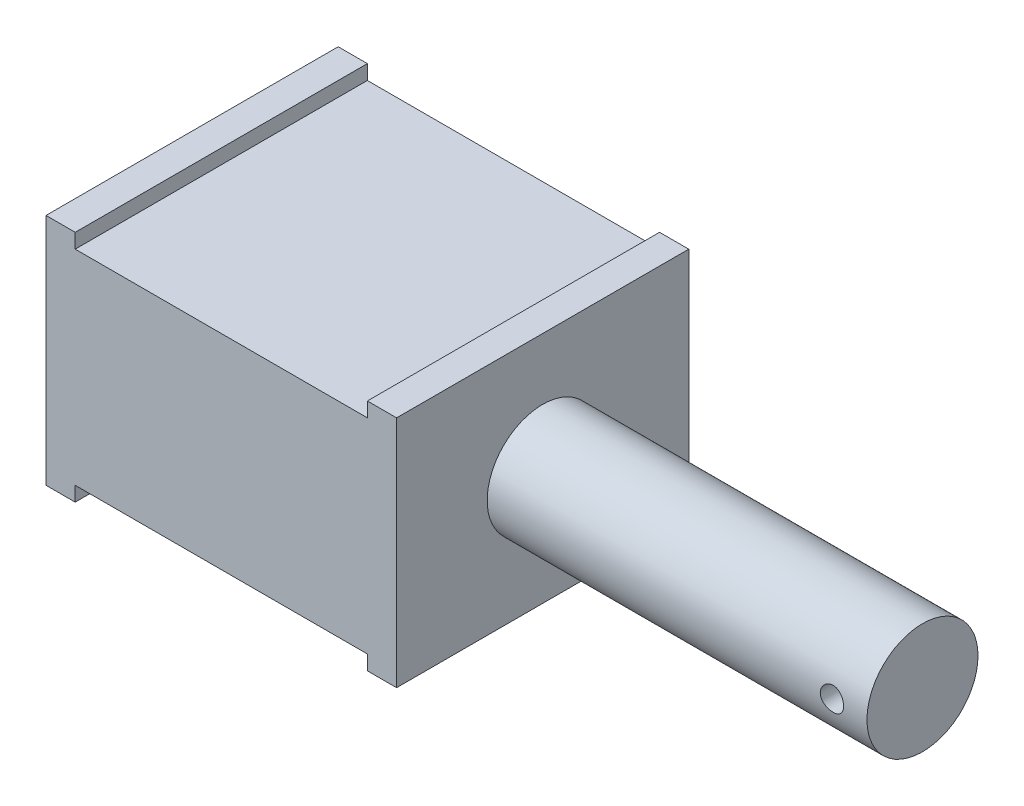
ISO-10303-21;
HEADER;
FILE_DESCRIPTION(('STEP AP214'),'2;1');
FILE_NAME('part.step','',(''),(''),'','','');
FILE_SCHEMA(('AUTOMOTIVE_DESIGN { 1 0 10303 214 1 1 1 1 }'));
ENDSEC;
DATA;
#1=APPLICATION_CONTEXT('core data for automotive mechanical design processes');
#2=APPLICATION_PROTOCOL_DEFINITION('international standard','automotive_design',2000,#1);
#3=PRODUCT_CONTEXT('',#1,'mechanical');
#4=PRODUCT('Part','Part','',(#3));
#5=PRODUCT_RELATED_PRODUCT_CATEGORY('part','',(#4));
#6=PRODUCT_DEFINITION_FORMATION('','',#4);
#7=PRODUCT_DEFINITION_CONTEXT('part definition',#1,'design');
#8=PRODUCT_DEFINITION('design','',#6,#7);
#9=PRODUCT_DEFINITION_SHAPE('','',#8);
#10=(LENGTH_UNIT() NAMED_UNIT(*) SI_UNIT(.MILLI.,.METRE.));
#11=(NAMED_UNIT(*) PLANE_ANGLE_UNIT() SI_UNIT($,.RADIAN.));
#12=(NAMED_UNIT(*) SI_UNIT($,.STERADIAN.) SOLID_ANGLE_UNIT());
#13=UNCERTAINTY_MEASURE_WITH_UNIT(LENGTH_MEASURE(1.E-05),#10,'distance_accuracy_value','');
#14=(GEOMETRIC_REPRESENTATION_CONTEXT(3) GLOBAL_UNCERTAINTY_ASSIGNED_CONTEXT((#13)) GLOBAL_UNIT_ASSIGNED_CONTEXT((#10,
#11,#12)) REPRESENTATION_CONTEXT('',''));
#15=CARTESIAN_POINT('',(0.,0.,0.));
#16=DIRECTION('',(0.,0.,1.));
#17=DIRECTION('',(1.,0.,0.));
#18=AXIS2_PLACEMENT_3D('',#15,#16,#17);
#19=CARTESIAN_POINT('',(18.,0.,0.));
#20=DIRECTION('',(0.,1.,0.));
#21=DIRECTION('',(0.,0.,1.));
#22=AXIS2_PLACEMENT_3D('',#19,#20,#21);
#23=PLANE('',#22);
#24=DIRECTION('',(-1.,0.,0.));
#25=VECTOR('',#24,1.);
#26=CARTESIAN_POINT('',(18.,0.,0.));
#27=LINE('',#26,#25);
#28=CARTESIAN_POINT('',(18.,0.,0.));
#29=VERTEX_POINT('',#28);
#30=CARTESIAN_POINT('',(16.5,0.,0.));
#31=VERTEX_POINT('',#30);
#32=EDGE_CURVE('E54',#29,#31,#27,.T.);
#33=ORIENTED_EDGE('',*,*,#32,.T.);
#34=DIRECTION('',(0.,0.,-1.));
#35=VECTOR('',#34,1.);
#36=CARTESIAN_POINT('',(16.5,0.,0.));
#37=LINE('',#36,#35);
#38=CARTESIAN_POINT('',(16.5,0.,-15.));
#39=VERTEX_POINT('',#38);
#40=EDGE_CURVE('E198',#31,#39,#37,.T.);
#41=ORIENTED_EDGE('',*,*,#40,.T.);
#42=DIRECTION('',(-1.,0.,0.));
#43=VECTOR('',#42,1.);
#44=CARTESIAN_POINT('',(18.,0.,-15.));
#45=LINE('',#44,#43);
#46=CARTESIAN_POINT('',(18.,0.,-15.));
#47=VERTEX_POINT('',#46);
#48=EDGE_CURVE('E260',#47,#39,#45,.T.);
#49=ORIENTED_EDGE('',*,*,#48,.F.);
#50=DIRECTION('',(0.,0.,-1.));
#51=VECTOR('',#50,1.);
#52=CARTESIAN_POINT('',(18.,0.,0.));
#53=LINE('',#52,#51);
#54=EDGE_CURVE('E227',#29,#47,#53,.T.);
#55=ORIENTED_EDGE('',*,*,#54,.F.);
#56=EDGE_LOOP('',(#33,#41,#49,#55));
#57=FACE_BOUND('',#56,.T.);
#58=ADVANCED_FACE('F39',(#57),#23,.F.);
#59=CARTESIAN_POINT('',(18.,12.,0.));
#60=DIRECTION('',(0.,-1.,0.));
#61=DIRECTION('',(0.,0.,-1.));
#62=AXIS2_PLACEMENT_3D('',#59,#60,#61);
#63=PLANE('',#62);
#64=DIRECTION('',(-1.,0.,0.));
#65=VECTOR('',#64,1.);
#66=CARTESIAN_POINT('',(18.,12.,-15.));
#67=LINE('',#66,#65);
#68=CARTESIAN_POINT('',(18.,12.,-15.));
#69=VERTEX_POINT('',#68);
#70=CARTESIAN_POINT('',(16.5,12.,-15.));
#71=VERTEX_POINT('',#70);
#72=EDGE_CURVE('E255',#69,#71,#67,.T.);
#73=ORIENTED_EDGE('',*,*,#72,.T.);
#74=DIRECTION('',(0.,0.,-1.));
#75=VECTOR('',#74,1.);
#76=CARTESIAN_POINT('',(16.5,12.,0.));
#77=LINE('',#76,#75);
#78=CARTESIAN_POINT('',(16.5,12.,0.));
#79=VERTEX_POINT('',#78);
#80=EDGE_CURVE('E176',#79,#71,#77,.T.);
#81=ORIENTED_EDGE('',*,*,#80,.F.);
#82=DIRECTION('',(-1.,0.,0.));
#83=VECTOR('',#82,1.);
#84=CARTESIAN_POINT('',(18.,12.,0.));
#85=LINE('',#84,#83);
#86=CARTESIAN_POINT('',(18.,12.,0.));
#87=VERTEX_POINT('',#86);
#88=EDGE_CURVE('E162',#87,#79,#85,.T.);
#89=ORIENTED_EDGE('',*,*,#88,.F.);
#90=DIRECTION('',(0.,0.,1.));
#91=VECTOR('',#90,1.);
#92=CARTESIAN_POINT('',(18.,12.,0.));
#93=LINE('',#92,#91);
#94=EDGE_CURVE('E234',#69,#87,#93,.T.);
#95=ORIENTED_EDGE('',*,*,#94,.F.);
#96=EDGE_LOOP('',(#73,#81,#89,#95));
#97=FACE_BOUND('',#96,.T.);
#98=ADVANCED_FACE('F295',(#97),#63,.F.);
#99=CARTESIAN_POINT('',(37.5,6.,-7.5));
#100=DIRECTION('',(-1.,0.,0.));
#101=DIRECTION('',(0.,0.,1.));
#102=AXIS2_PLACEMENT_3D('',#99,#100,#101);
#103=CYLINDRICAL_SURFACE('',#102,2.85);
#104=CARTESIAN_POINT('',(37.5,6.,-7.5));
#105=DIRECTION('',(1.,0.,0.));
#106=DIRECTION('',(0.,0.,-1.));
#107=AXIS2_PLACEMENT_3D('',#104,#105,#106);
#108=CIRCLE('',#107,2.85);
#109=CARTESIAN_POINT('',(37.5,6.,-10.35));
#110=VERTEX_POINT('',#109);
#111=EDGE_CURVE('E218',#110,#110,#108,.T.);
#112=ORIENTED_EDGE('',*,*,#111,.F.);
#113=EDGE_LOOP('',(#112));
#114=FACE_BOUND('',#113,.T.);
#115=CARTESIAN_POINT('',(18.,6.,-7.5));
#116=DIRECTION('',(1.,0.,0.));
#117=DIRECTION('',(0.,0.,-1.));
#118=AXIS2_PLACEMENT_3D('',#115,#116,#117);
#119=CIRCLE('',#118,2.85);
#120=CARTESIAN_POINT('',(18.,6.,-10.35));
#121=VERTEX_POINT('',#120);
#122=EDGE_CURVE('E11',#121,#121,#119,.T.);
#123=ORIENTED_EDGE('',*,*,#122,.T.);
#124=EDGE_LOOP('',(#123));
#125=FACE_BOUND('',#124,.T.);
#126=CARTESIAN_POINT('',(36.3,6.,-10.35));
#127=CARTESIAN_POINT('',(36.2999988213726,5.96669169257793,-10.3499993833989));
#128=CARTESIAN_POINT('',(36.2972170237755,5.93336885409063,-10.3494101220335));
#129=CARTESIAN_POINT('',(36.2861736647326,5.86766763069668,-10.3471163216296));
#130=CARTESIAN_POINT('',(36.2779079913875,5.83528997353559,-10.3454109457234));
#131=CARTESIAN_POINT('',(36.2561655974072,5.77243831369301,-10.3410750433109));
#132=CARTESIAN_POINT('',(36.2426941185744,5.74196243182425,-10.3384454476554));
#133=CARTESIAN_POINT('',(36.2109386880287,5.68370499133095,-10.332545831752));
#134=CARTESIAN_POINT('',(36.1926549329214,5.65592332269772,-10.329275837669));
#135=CARTESIAN_POINT('',(36.1515048949265,5.60342668300566,-10.3223998197008));
#136=CARTESIAN_POINT('',(36.1285805854412,5.57875770456691,-10.3187898860191));
#137=CARTESIAN_POINT('',(36.078924824435,5.53358525972532,-10.3116687975785));
#138=CARTESIAN_POINT('',(36.0521930532207,5.51308214346004,-10.3081576511441));
#139=CARTESIAN_POINT('',(35.9953452557859,5.47662371600545,-10.3015933067478));
#140=CARTESIAN_POINT('',(35.9651975816267,5.46071676770002,-10.2985451283262));
#141=CARTESIAN_POINT('',(35.9025824404609,5.43421226127206,-10.2933077086585));
#142=CARTESIAN_POINT('',(35.870115229479,5.42361411820838,-10.2911183727882));
#143=CARTESIAN_POINT('',(35.8042797563809,5.40817886460487,-10.2878862301906));
#144=CARTESIAN_POINT('',(35.770931317809,5.40326064855097,-10.2868272990544));
#145=CARTESIAN_POINT('',(35.7038671229165,5.39907278962,-10.2859273887886));
#146=CARTESIAN_POINT('',(35.6701514087546,5.39980250511567,-10.2860862713107));
#147=CARTESIAN_POINT('',(35.6039083629354,5.40682438960428,-10.2875894150357));
#148=CARTESIAN_POINT('',(35.5713705823523,5.4130229011031,-10.2889137165392));
#149=CARTESIAN_POINT('',(35.5078073360638,5.4306582881933,-10.2925669839552));
#150=CARTESIAN_POINT('',(35.4767819496704,5.44209543817939,-10.2948960024934));
#151=CARTESIAN_POINT('',(35.4168579347607,5.46997097242663,-10.3003162812852));
#152=CARTESIAN_POINT('',(35.387976810514,5.48644586525073,-10.3034130735268));
#153=CARTESIAN_POINT('',(35.3333541622109,5.52390351382727,-10.310016506398));
#154=CARTESIAN_POINT('',(35.3076130368086,5.54488684103828,-10.3135231989581));
#155=CARTESIAN_POINT('',(35.2594613154755,5.59126404219434,-10.3206373302547));
#156=CARTESIAN_POINT('',(35.2371275741169,5.61673769076342,-10.3242453817127));
#157=CARTESIAN_POINT('',(35.1970372482855,5.67110894814406,-10.3310917073164));
#158=CARTESIAN_POINT('',(35.1792807353231,5.70000661043885,-10.3343299756845));
#159=CARTESIAN_POINT('',(35.1488320712018,5.76049561601912,-10.3400811965174));
#160=CARTESIAN_POINT('',(35.136149413639,5.7920918758539,-10.3425927869018));
#161=CARTESIAN_POINT('',(35.1162942335019,5.85703148327319,-10.3465974527912));
#162=CARTESIAN_POINT('',(35.1091209698436,5.89037459523899,-10.3480906652781));
#163=CARTESIAN_POINT('',(35.1005986480812,5.95720164625685,-10.349871021641));
#164=CARTESIAN_POINT('',(35.099144520851,5.9906716235672,-10.3501799204375));
#165=CARTESIAN_POINT('',(35.1018177808996,6.05737625040147,-10.3496175673532));
#166=CARTESIAN_POINT('',(35.1059448188249,6.09061091452393,-10.3487463893392));
#167=CARTESIAN_POINT('',(35.1195760512223,6.15555748558171,-10.3459354463096));
#168=CARTESIAN_POINT('',(35.1290256729374,6.18728135750695,-10.3440065315576));
#169=CARTESIAN_POINT('',(35.1529736808643,6.24869404906925,-10.3392958046892));
#170=CARTESIAN_POINT('',(35.1674724747476,6.27838270415062,-10.3365139237063));
#171=CARTESIAN_POINT('',(35.2013299238425,6.33532056417375,-10.330351918051));
#172=CARTESIAN_POINT('',(35.220750991811,6.36253182624667,-10.3269642888412));
#173=CARTESIAN_POINT('',(35.2638188956408,6.41334684281196,-10.3199828767937));
#174=CARTESIAN_POINT('',(35.2874662372025,6.43695016496371,-10.3163890693204));
#175=CARTESIAN_POINT('',(35.3387959073263,6.4802902856714,-10.3093260080057));
#176=CARTESIAN_POINT('',(35.3665399495677,6.49995459989885,-10.3058599065968));
#177=CARTESIAN_POINT('',(35.4249987657895,6.53434461459651,-10.2995147584666));
#178=CARTESIAN_POINT('',(35.4557134148745,6.54907052257988,-10.2966356870802));
#179=CARTESIAN_POINT('',(35.5190805141422,6.57307021468571,-10.2918167068293));
#180=CARTESIAN_POINT('',(35.5517213046587,6.58237370881136,-10.2898716907099));
#181=CARTESIAN_POINT('',(35.6181486957946,6.59535299268467,-10.2871310724402));
#182=CARTESIAN_POINT('',(35.651935127808,6.59902960690812,-10.2863353018982));
#183=CARTESIAN_POINT('',(35.7189653180989,6.60061770551793,-10.2859933257568));
#184=CARTESIAN_POINT('',(35.7522062831022,6.5986439337122,-10.2864222495188));
#185=CARTESIAN_POINT('',(35.8178707709834,6.58924233848511,-10.2884253903077));
#186=CARTESIAN_POINT('',(35.8502943020628,6.58181456980844,-10.2899995958389));
#187=CARTESIAN_POINT('',(35.9133205153665,6.56176938992313,-10.2941042475459));
#188=CARTESIAN_POINT('',(35.9439283335599,6.54916750265077,-10.2966318314661));
#189=CARTESIAN_POINT('',(36.002612709923,6.51914560119129,-10.3023597842811));
#190=CARTESIAN_POINT('',(36.0306890267362,6.50172512823689,-10.3055602172296));
#191=CARTESIAN_POINT('',(36.0840816459411,6.46217490105738,-10.3123483643455));
#192=CARTESIAN_POINT('',(36.1093362382261,6.43996287727174,-10.3159422211372));
#193=CARTESIAN_POINT('',(36.1557974132668,6.3916282272389,-10.323069769837));
#194=CARTESIAN_POINT('',(36.1770030621362,6.36550470127923,-10.3266034476939));
#195=CARTESIAN_POINT('',(36.2150030994762,6.30971669611824,-10.3332619353321));
#196=CARTESIAN_POINT('',(36.2317423550432,6.2800139953063,-10.3363814156758));
#197=CARTESIAN_POINT('',(36.2599647053937,6.2181583614205,-10.3418070551112));
#198=CARTESIAN_POINT('',(36.2714523570882,6.18600758096124,-10.3441139189245));
#199=CARTESIAN_POINT('',(36.2867180082841,6.12817177713178,-10.3472263112084));
#200=CARTESIAN_POINT('',(36.2916895352439,6.10280727020385,-10.3482601628991));
#201=CARTESIAN_POINT('',(36.2983309245285,6.05163140800684,-10.3496472332148));
#202=CARTESIAN_POINT('',(36.3000009136532,6.02582006993732,-10.3500004779794));
#203=CARTESIAN_POINT('',(36.3,6.,-10.35));
#204=B_SPLINE_CURVE_WITH_KNOTS('',3,(#126,#127,#128,#129,#130,#131,#132,#133,#134,#135,#136,
#137,#138,#139,#140,#141,#142,#143,#144,#145,#146,#147,#148,#149,#150,#151,#152,#153,#154,#155,
#156,#157,#158,#159,#160,#161,#162,#163,#164,#165,#166,#167,#168,#169,#170,#171,#172,#173,#174,
#175,#176,#177,#178,#179,#180,#181,#182,#183,#184,#185,#186,#187,#188,#189,#190,#191,#192,#193,
#194,#195,#196,#197,#198,#199,#200,#201,#202,#203),.UNSPECIFIED.,.T.,.F.,(4,2,2,2,2,2,2,2,2,2,2,
2,2,2,2,2,2,2,2,2,2,2,2,2,2,2,2,2,2,2,2,2,2,2,2,2,2,2,4),(0.,0.0998304351093814,
0.199735809429211,0.29954084857678,0.399341810820496,0.500477759197621,0.601622204461458,
0.703795107247162,0.805956749817842,0.906640817258482,1.00731344676059,1.10629473427437,
1.20528120692332,1.30500275525524,1.40473695107941,1.50646463059837,1.60819389931718,
1.71011263139317,1.81201765169425,1.91204152849048,2.01205914457507,2.11106946807393,
2.21008778754792,2.31043060568899,2.41078543853262,2.51284484330168,2.61489995896917,
2.71639051516611,2.81786619908541,2.91729589726264,3.01672459742447,3.11585713607928,
3.2149991161825,3.31600232883713,3.41702880975095,3.51925002237575,3.62138236666931,
3.69877230386312,3.77615926873451),.UNSPECIFIED.);
#205=CARTESIAN_POINT('',(36.3,6.,-10.35));
#206=VERTEX_POINT('',#205);
#207=EDGE_CURVE('E179',#206,#206,#204,.T.);
#208=ORIENTED_EDGE('',*,*,#207,.F.);
#209=EDGE_LOOP('',(#208));
#210=FACE_BOUND('',#209,.T.);
#211=CARTESIAN_POINT('',(36.3,6.,-4.65));
#212=CARTESIAN_POINT('',(36.2999988213726,6.03330830742208,-4.65000061660115));
#213=CARTESIAN_POINT('',(36.2972170237755,6.06663114590937,-4.65058987796654));
#214=CARTESIAN_POINT('',(36.2861736647326,6.13233236930332,-4.65288367837037));
#215=CARTESIAN_POINT('',(36.2779079913875,6.16471002646441,-4.65458905427663));
#216=CARTESIAN_POINT('',(36.2561655974072,6.22756168630699,-4.6589249566891));
#217=CARTESIAN_POINT('',(36.2426941185744,6.25803756817575,-4.66155455234458));
#218=CARTESIAN_POINT('',(36.2109386880287,6.31629500866905,-4.66745416824796));
#219=CARTESIAN_POINT('',(36.1926549329214,6.34407667730228,-4.67072416233098));
#220=CARTESIAN_POINT('',(36.1515048949265,6.39657331699434,-4.67760018029917));
#221=CARTESIAN_POINT('',(36.1285805854412,6.42124229543309,-4.68121011398092));
#222=CARTESIAN_POINT('',(36.078924824435,6.46641474027468,-4.68833120242147));
#223=CARTESIAN_POINT('',(36.0521930532207,6.48691785653996,-4.69184234885594));
#224=CARTESIAN_POINT('',(35.9953452557859,6.52337628399456,-4.69840669325215));
#225=CARTESIAN_POINT('',(35.9651975816267,6.53928323229998,-4.70145487167375));
#226=CARTESIAN_POINT('',(35.9025824404609,6.56578773872794,-4.70669229134147));
#227=CARTESIAN_POINT('',(35.870115229479,6.57638588179162,-4.70888162721184));
#228=CARTESIAN_POINT('',(35.8042797563809,6.59182113539513,-4.71211376980941));
#229=CARTESIAN_POINT('',(35.770931317809,6.59673935144903,-4.71317270094564));
#230=CARTESIAN_POINT('',(35.7038671229165,6.60092721038,-4.71407261121137));
#231=CARTESIAN_POINT('',(35.6701514087546,6.60019749488433,-4.71391372868931));
#232=CARTESIAN_POINT('',(35.6039083629354,6.59317561039572,-4.71241058496433));
#233=CARTESIAN_POINT('',(35.5713705823523,6.5869770988969,-4.7110862834608));
#234=CARTESIAN_POINT('',(35.5078073360638,6.5693417118067,-4.70743301604481));
#235=CARTESIAN_POINT('',(35.4767819496704,6.55790456182061,-4.70510399750665));
#236=CARTESIAN_POINT('',(35.4168579347607,6.53002902757337,-4.69968371871477));
#237=CARTESIAN_POINT('',(35.387976810514,6.51355413474927,-4.6965869264732));
#238=CARTESIAN_POINT('',(35.3333541622109,6.47609648617273,-4.68998349360198));
#239=CARTESIAN_POINT('',(35.3076130368086,6.45511315896172,-4.68647680104186));
#240=CARTESIAN_POINT('',(35.2594613154755,6.40873595780566,-4.67936266974533));
#241=CARTESIAN_POINT('',(35.2371275741169,6.38326230923658,-4.67575461828731));
#242=CARTESIAN_POINT('',(35.1970372482855,6.32889105185594,-4.66890829268363));
#243=CARTESIAN_POINT('',(35.1792807353231,6.29999338956115,-4.66567002431554));
#244=CARTESIAN_POINT('',(35.1488320712018,6.23950438398089,-4.65991880348262));
#245=CARTESIAN_POINT('',(35.136149413639,6.2079081241461,-4.65740721309823));
#246=CARTESIAN_POINT('',(35.1162942335019,6.14296851672681,-4.65340254720879));
#247=CARTESIAN_POINT('',(35.1091209698436,6.10962540476101,-4.6519093347219));
#248=CARTESIAN_POINT('',(35.1005986480812,6.04279835374315,-4.65012897835897));
#249=CARTESIAN_POINT('',(35.099144520851,6.0093283764328,-4.64982007956247));
#250=CARTESIAN_POINT('',(35.1018177808996,5.94262374959853,-4.65038243264685));
#251=CARTESIAN_POINT('',(35.1059448188249,5.90938908547607,-4.65125361066075));
#252=CARTESIAN_POINT('',(35.1195760512223,5.84444251441829,-4.65406455369038));
#253=CARTESIAN_POINT('',(35.1290256729374,5.81271864249306,-4.65599346844237));
#254=CARTESIAN_POINT('',(35.1529736808643,5.75130595093075,-4.66070419531076));
#255=CARTESIAN_POINT('',(35.1674724747476,5.72161729584938,-4.66348607629372));
#256=CARTESIAN_POINT('',(35.2013299238425,5.66467943582625,-4.66964808194902));
#257=CARTESIAN_POINT('',(35.220750991811,5.63746817375333,-4.67303571115881));
#258=CARTESIAN_POINT('',(35.2638188956408,5.58665315718804,-4.68001712320632));
#259=CARTESIAN_POINT('',(35.2874662372025,5.56304983503629,-4.68361093067959));
#260=CARTESIAN_POINT('',(35.3387959073263,5.5197097143286,-4.69067399199434));
#261=CARTESIAN_POINT('',(35.3665399495677,5.50004540010115,-4.69414009340323));
#262=CARTESIAN_POINT('',(35.4249987657895,5.46565538540349,-4.70048524153338));
#263=CARTESIAN_POINT('',(35.4557134148745,5.45092947742012,-4.7033643129198));
#264=CARTESIAN_POINT('',(35.5190805141422,5.42692978531429,-4.70818329317066));
#265=CARTESIAN_POINT('',(35.5517213046587,5.41762629118864,-4.71012830929005));
#266=CARTESIAN_POINT('',(35.6181486957946,5.40464700731533,-4.7128689275598));
#267=CARTESIAN_POINT('',(35.651935127808,5.40097039309188,-4.71366469810182));
#268=CARTESIAN_POINT('',(35.7189653180989,5.39938229448207,-4.7140066742432));
#269=CARTESIAN_POINT('',(35.7522062831022,5.4013560662878,-4.7135777504812));
#270=CARTESIAN_POINT('',(35.8178707709834,5.41075766151489,-4.71157460969225));
#271=CARTESIAN_POINT('',(35.8502943020628,5.41818543019156,-4.71000040416112));
#272=CARTESIAN_POINT('',(35.9133205153665,5.43823061007687,-4.7058957524541));
#273=CARTESIAN_POINT('',(35.9439283335599,5.45083249734923,-4.70336816853394));
#274=CARTESIAN_POINT('',(36.002612709923,5.48085439880871,-4.69764021571886));
#275=CARTESIAN_POINT('',(36.0306890267362,5.49827487176311,-4.69443978277039));
#276=CARTESIAN_POINT('',(36.0840816459411,5.53782509894262,-4.68765163565447));
#277=CARTESIAN_POINT('',(36.1093362382261,5.56003712272825,-4.68405777886276));
#278=CARTESIAN_POINT('',(36.1557974132668,5.6083717727611,-4.67693023016305));
#279=CARTESIAN_POINT('',(36.1770030621362,5.63449529872076,-4.67339655230605));
#280=CARTESIAN_POINT('',(36.2150030994762,5.69028330388176,-4.66673806466786));
#281=CARTESIAN_POINT('',(36.2317423550432,5.7199860046937,-4.66361858432416));
#282=CARTESIAN_POINT('',(36.2599647053937,5.7818416385795,-4.65819294488877));
#283=CARTESIAN_POINT('',(36.2714523570882,5.81399241903876,-4.65588608107553));
#284=CARTESIAN_POINT('',(36.2867180082841,5.87182822286822,-4.65277368879164));
#285=CARTESIAN_POINT('',(36.2916895352439,5.89719272979614,-4.65173983710087));
#286=CARTESIAN_POINT('',(36.2983309245285,5.94836859199316,-4.65035276678515));
#287=CARTESIAN_POINT('',(36.3000009136532,5.97417993006268,-4.6499995220206));
#288=CARTESIAN_POINT('',(36.3,6.,-4.65));
#289=B_SPLINE_CURVE_WITH_KNOTS('',3,(#211,#212,#213,#214,#215,#216,#217,#218,#219,#220,#221,
#222,#223,#224,#225,#226,#227,#228,#229,#230,#231,#232,#233,#234,#235,#236,#237,#238,#239,#240,
#241,#242,#243,#244,#245,#246,#247,#248,#249,#250,#251,#252,#253,#254,#255,#256,#257,#258,#259,
#260,#261,#262,#263,#264,#265,#266,#267,#268,#269,#270,#271,#272,#273,#274,#275,#276,#277,#278,
#279,#280,#281,#282,#283,#284,#285,#286,#287,#288),.UNSPECIFIED.,.T.,.F.,(4,2,2,2,2,2,2,2,2,2,2,
2,2,2,2,2,2,2,2,2,2,2,2,2,2,2,2,2,2,2,2,2,2,2,2,2,2,2,4),(0.,0.0998304351093823,
0.199735809429211,0.299540848576781,0.399341810820498,0.500477759197622,0.601622204461465,
0.703795107247169,0.805956749817842,0.906640817258468,1.00731344676059,1.10629473427437,
1.20528120692332,1.30500275525524,1.40473695107941,1.50646463059837,1.60819389931718,
1.71011263139317,1.81201765169425,1.91204152849048,2.01205914457507,2.11106946807392,
2.21008778754792,2.31043060568899,2.41078543853262,2.51284484330168,2.61489995896917,
2.71639051516611,2.81786619908541,2.91729589726264,3.01672459742447,3.11585713607928,
3.21499911618249,3.31600232883712,3.41702880975095,3.51925002237575,3.62138236666931,
3.69877230386312,3.77615926873451),.UNSPECIFIED.);
#290=CARTESIAN_POINT('',(36.3,6.,-4.65));
#291=VERTEX_POINT('',#290);
#292=EDGE_CURVE('E43',#291,#291,#289,.T.);
#293=ORIENTED_EDGE('',*,*,#292,.F.);
#294=EDGE_LOOP('',(#293));
#295=FACE_BOUND('',#294,.T.);
#296=ADVANCED_FACE('F272',(#114,#125,#210,#295),#103,.T.);
#297=CARTESIAN_POINT('',(18.,0.,0.));
#298=DIRECTION('',(0.,0.,-1.));
#299=DIRECTION('',(-1.,0.,0.));
#300=AXIS2_PLACEMENT_3D('',#297,#298,#299);
#301=PLANE('',#300);
#302=ORIENTED_EDGE('',*,*,#88,.T.);
#303=DIRECTION('',(0.,-1.,0.));
#304=VECTOR('',#303,1.);
#305=CARTESIAN_POINT('',(16.5,12.,0.));
#306=LINE('',#305,#304);
#307=CARTESIAN_POINT('',(16.5,11.25,0.));
#308=VERTEX_POINT('',#307);
#309=EDGE_CURVE('E140',#79,#308,#306,.T.);
#310=ORIENTED_EDGE('',*,*,#309,.T.);
#311=DIRECTION('',(-1.,0.,0.));
#312=VECTOR('',#311,1.);
#313=CARTESIAN_POINT('',(16.5,11.25,0.));
#314=LINE('',#313,#312);
#315=CARTESIAN_POINT('',(1.5,11.25,0.));
#316=VERTEX_POINT('',#315);
#317=EDGE_CURVE('E152',#308,#316,#314,.T.);
#318=ORIENTED_EDGE('',*,*,#317,.T.);
#319=DIRECTION('',(0.,1.,0.));
#320=VECTOR('',#319,1.);
#321=CARTESIAN_POINT('',(1.5,11.25,0.));
#322=LINE('',#321,#320);
#323=CARTESIAN_POINT('',(1.5,12.,0.));
#324=VERTEX_POINT('',#323);
#325=EDGE_CURVE('E149',#316,#324,#322,.T.);
#326=ORIENTED_EDGE('',*,*,#325,.T.);
#327=CARTESIAN_POINT('',(0.,12.,0.));
#328=VERTEX_POINT('',#327);
#329=EDGE_CURVE('E237',#324,#328,#85,.T.);
#330=ORIENTED_EDGE('',*,*,#329,.T.);
#331=DIRECTION('',(0.,-1.,0.));
#332=VECTOR('',#331,1.);
#333=CARTESIAN_POINT('',(0.,0.,0.));
#334=LINE('',#333,#332);
#335=CARTESIAN_POINT('',(0.,0.,0.));
#336=VERTEX_POINT('',#335);
#337=EDGE_CURVE('E221',#328,#336,#334,.T.);
#338=ORIENTED_EDGE('',*,*,#337,.T.);
#339=CARTESIAN_POINT('',(1.5,0.,0.));
#340=VERTEX_POINT('',#339);
#341=EDGE_CURVE('E264',#340,#336,#27,.T.);
#342=ORIENTED_EDGE('',*,*,#341,.F.);
#343=DIRECTION('',(0.,1.,0.));
#344=VECTOR('',#343,1.);
#345=CARTESIAN_POINT('',(1.5,0.749999999999999,0.));
#346=LINE('',#345,#344);
#347=CARTESIAN_POINT('',(1.5,0.749999999999999,0.));
#348=VERTEX_POINT('',#347);
#349=EDGE_CURVE('E189',#340,#348,#346,.T.);
#350=ORIENTED_EDGE('',*,*,#349,.T.);
#351=DIRECTION('',(1.,0.,0.));
#352=VECTOR('',#351,1.);
#353=CARTESIAN_POINT('',(16.5,0.749999999999999,0.));
#354=LINE('',#353,#352);
#355=CARTESIAN_POINT('',(16.5,0.749999999999999,0.));
#356=VERTEX_POINT('',#355);
#357=EDGE_CURVE('E194',#348,#356,#354,.T.);
#358=ORIENTED_EDGE('',*,*,#357,.T.);
#359=DIRECTION('',(0.,-1.,0.));
#360=VECTOR('',#359,1.);
#361=CARTESIAN_POINT('',(16.5,0.749999999999999,0.));
#362=LINE('',#361,#360);
#363=EDGE_CURVE('E185',#356,#31,#362,.T.);
#364=ORIENTED_EDGE('',*,*,#363,.T.);
#365=ORIENTED_EDGE('',*,*,#32,.F.);
#366=DIRECTION('',(0.,-1.,0.));
#367=VECTOR('',#366,1.);
#368=CARTESIAN_POINT('',(18.,0.,0.));
#369=LINE('',#368,#367);
#370=EDGE_CURVE('E223',#87,#29,#369,.T.);
#371=ORIENTED_EDGE('',*,*,#370,.F.);
#372=EDGE_LOOP('',(#302,#310,#318,#326,#330,#338,#342,#350,#358,#364,#365,#371));
#373=FACE_BOUND('',#372,.T.);
#374=ADVANCED_FACE('F41',(#373),#301,.F.);
#375=CARTESIAN_POINT('',(1.5,0.,-15.));
#376=VERTEX_POINT('',#375);
#377=CARTESIAN_POINT('',(0.,0.,-15.));
#378=VERTEX_POINT('',#377);
#379=EDGE_CURVE('E259',#376,#378,#45,.T.);
#380=ORIENTED_EDGE('',*,*,#379,.F.);
#381=DIRECTION('',(0.,0.,-1.));
#382=VECTOR('',#381,1.);
#383=CARTESIAN_POINT('',(1.5,0.,0.));
#384=LINE('',#383,#382);
#385=EDGE_CURVE('E62',#340,#376,#384,.T.);
#386=ORIENTED_EDGE('',*,*,#385,.F.);
#387=ORIENTED_EDGE('',*,*,#341,.T.);
#388=DIRECTION('',(0.,0.,-1.));
#389=VECTOR('',#388,1.);
#390=CARTESIAN_POINT('',(0.,0.,0.));
#391=LINE('',#390,#389);
#392=EDGE_CURVE('E241',#336,#378,#391,.T.);
#393=ORIENTED_EDGE('',*,*,#392,.T.);
#394=EDGE_LOOP('',(#380,#386,#387,#393));
#395=FACE_BOUND('',#394,.T.);
#396=ADVANCED_FACE('F297',(#395),#23,.F.);
#397=CARTESIAN_POINT('',(18.,0.,-15.));
#398=DIRECTION('',(0.,0.,1.));
#399=DIRECTION('',(1.,0.,0.));
#400=AXIS2_PLACEMENT_3D('',#397,#398,#399);
#401=PLANE('',#400);
#402=DIRECTION('',(-1.,0.,0.));
#403=VECTOR('',#402,1.);
#404=CARTESIAN_POINT('',(16.5,11.25,-15.));
#405=LINE('',#404,#403);
#406=CARTESIAN_POINT('',(16.5,11.25,-15.));
#407=VERTEX_POINT('',#406);
#408=CARTESIAN_POINT('',(1.5,11.25,-15.));
#409=VERTEX_POINT('',#408);
#410=EDGE_CURVE('E166',#407,#409,#405,.T.);
#411=ORIENTED_EDGE('',*,*,#410,.F.);
#412=DIRECTION('',(0.,-1.,0.));
#413=VECTOR('',#412,1.);
#414=CARTESIAN_POINT('',(16.5,12.,-15.));
#415=LINE('',#414,#413);
#416=EDGE_CURVE('E143',#71,#407,#415,.T.);
#417=ORIENTED_EDGE('',*,*,#416,.F.);
#418=ORIENTED_EDGE('',*,*,#72,.F.);
#419=DIRECTION('',(0.,1.,0.));
#420=VECTOR('',#419,1.);
#421=CARTESIAN_POINT('',(18.,0.,-15.));
#422=LINE('',#421,#420);
#423=EDGE_CURVE('E231',#47,#69,#422,.T.);
#424=ORIENTED_EDGE('',*,*,#423,.F.);
#425=ORIENTED_EDGE('',*,*,#48,.T.);
#426=DIRECTION('',(0.,-1.,0.));
#427=VECTOR('',#426,1.);
#428=CARTESIAN_POINT('',(16.5,0.749999999999999,-15.));
#429=LINE('',#428,#427);
#430=CARTESIAN_POINT('',(16.5,0.749999999999999,-15.));
#431=VERTEX_POINT('',#430);
#432=EDGE_CURVE('E199',#431,#39,#429,.T.);
#433=ORIENTED_EDGE('',*,*,#432,.F.);
#434=DIRECTION('',(1.,0.,0.));
#435=VECTOR('',#434,1.);
#436=CARTESIAN_POINT('',(16.5,0.749999999999999,-15.));
#437=LINE('',#436,#435);
#438=CARTESIAN_POINT('',(1.5,0.749999999999999,-15.));
#439=VERTEX_POINT('',#438);
#440=EDGE_CURVE('E190',#439,#431,#437,.T.);
#441=ORIENTED_EDGE('',*,*,#440,.F.);
#442=DIRECTION('',(0.,1.,0.));
#443=VECTOR('',#442,1.);
#444=CARTESIAN_POINT('',(1.5,0.749999999999999,-15.));
#445=LINE('',#444,#443);
#446=EDGE_CURVE('E202',#376,#439,#445,.T.);
#447=ORIENTED_EDGE('',*,*,#446,.F.);
#448=ORIENTED_EDGE('',*,*,#379,.T.);
#449=DIRECTION('',(0.,1.,0.));
#450=VECTOR('',#449,1.);
#451=CARTESIAN_POINT('',(0.,0.,-15.));
#452=LINE('',#451,#450);
#453=CARTESIAN_POINT('',(0.,12.,-15.));
#454=VERTEX_POINT('',#453);
#455=EDGE_CURVE('E245',#378,#454,#452,.T.);
#456=ORIENTED_EDGE('',*,*,#455,.T.);
#457=CARTESIAN_POINT('',(1.5,12.,-15.));
#458=VERTEX_POINT('',#457);
#459=EDGE_CURVE('E254',#458,#454,#67,.T.);
#460=ORIENTED_EDGE('',*,*,#459,.F.);
#461=DIRECTION('',(0.,1.,0.));
#462=VECTOR('',#461,1.);
#463=CARTESIAN_POINT('',(1.5,11.25,-15.));
#464=LINE('',#463,#462);
#465=EDGE_CURVE('E70',#409,#458,#464,.T.);
#466=ORIENTED_EDGE('',*,*,#465,.F.);
#467=EDGE_LOOP('',(#411,#417,#418,#424,#425,#433,#441,#447,#448,#456,#460,#466));
#468=FACE_BOUND('',#467,.T.);
#469=ADVANCED_FACE('F306',(#468),#401,.F.);
#470=ORIENTED_EDGE('',*,*,#329,.F.);
#471=DIRECTION('',(0.,0.,-1.));
#472=VECTOR('',#471,1.);
#473=CARTESIAN_POINT('',(1.5,12.,0.));
#474=LINE('',#473,#472);
#475=EDGE_CURVE('E180',#324,#458,#474,.T.);
#476=ORIENTED_EDGE('',*,*,#475,.T.);
#477=ORIENTED_EDGE('',*,*,#459,.T.);
#478=DIRECTION('',(0.,0.,1.));
#479=VECTOR('',#478,1.);
#480=CARTESIAN_POINT('',(0.,12.,0.));
#481=LINE('',#480,#479);
#482=EDGE_CURVE('E228',#454,#328,#481,.T.);
#483=ORIENTED_EDGE('',*,*,#482,.T.);
#484=EDGE_LOOP('',(#470,#476,#477,#483));
#485=FACE_BOUND('',#484,.T.);
#486=ADVANCED_FACE('F303',(#485),#63,.F.);
#487=CARTESIAN_POINT('',(18.,0.,0.));
#488=DIRECTION('',(-1.,0.,0.));
#489=DIRECTION('',(0.,0.,1.));
#490=AXIS2_PLACEMENT_3D('',#487,#488,#489);
#491=PLANE('',#490);
#492=ORIENTED_EDGE('',*,*,#122,.F.);
#493=EDGE_LOOP('',(#492));
#494=FACE_BOUND('',#493,.T.);
#495=ORIENTED_EDGE('',*,*,#370,.T.);
#496=ORIENTED_EDGE('',*,*,#54,.T.);
#497=ORIENTED_EDGE('',*,*,#423,.T.);
#498=ORIENTED_EDGE('',*,*,#94,.T.);
#499=EDGE_LOOP('',(#495,#496,#497,#498));
#500=FACE_BOUND('',#499,.T.);
#501=ADVANCED_FACE('F291',(#494,#500),#491,.F.);
#502=CARTESIAN_POINT('',(0.,0.,0.));
#503=DIRECTION('',(-1.,0.,0.));
#504=DIRECTION('',(0.,0.,1.));
#505=AXIS2_PLACEMENT_3D('',#502,#503,#504);
#506=PLANE('',#505);
#507=ORIENTED_EDGE('',*,*,#337,.F.);
#508=ORIENTED_EDGE('',*,*,#482,.F.);
#509=ORIENTED_EDGE('',*,*,#455,.F.);
#510=ORIENTED_EDGE('',*,*,#392,.F.);
#511=EDGE_LOOP('',(#507,#508,#509,#510));
#512=FACE_BOUND('',#511,.T.);
#513=ADVANCED_FACE('F286',(#512),#506,.T.);
#514=CARTESIAN_POINT('',(37.5,6.,-7.5));
#515=DIRECTION('',(1.,0.,0.));
#516=DIRECTION('',(0.,0.,-1.));
#517=AXIS2_PLACEMENT_3D('',#514,#515,#516);
#518=PLANE('',#517);
#519=ORIENTED_EDGE('',*,*,#111,.T.);
#520=EDGE_LOOP('',(#519));
#521=FACE_BOUND('',#520,.T.);
#522=ADVANCED_FACE('F280',(#521),#518,.T.);
#523=CARTESIAN_POINT('',(35.7,6.,-12.));
#524=DIRECTION('',(0.,0.,1.));
#525=DIRECTION('',(1.,0.,0.));
#526=AXIS2_PLACEMENT_3D('',#523,#524,#525);
#527=CYLINDRICAL_SURFACE('',#526,0.600000000000002);
#528=ORIENTED_EDGE('',*,*,#207,.T.);
#529=EDGE_LOOP('',(#528));
#530=FACE_BOUND('',#529,.T.);
#531=ORIENTED_EDGE('',*,*,#292,.T.);
#532=EDGE_LOOP('',(#531));
#533=FACE_BOUND('',#532,.T.);
#534=ADVANCED_FACE('F276',(#530,#533),#527,.F.);
#535=CARTESIAN_POINT('',(16.5,12.,0.));
#536=DIRECTION('',(1.,0.,0.));
#537=DIRECTION('',(0.,1.,0.));
#538=AXIS2_PLACEMENT_3D('',#535,#536,#537);
#539=PLANE('',#538);
#540=ORIENTED_EDGE('',*,*,#416,.T.);
#541=DIRECTION('',(0.,0.,-1.));
#542=VECTOR('',#541,1.);
#543=CARTESIAN_POINT('',(16.5,11.25,0.));
#544=LINE('',#543,#542);
#545=EDGE_CURVE('E136',#308,#407,#544,.T.);
#546=ORIENTED_EDGE('',*,*,#545,.F.);
#547=ORIENTED_EDGE('',*,*,#309,.F.);
#548=ORIENTED_EDGE('',*,*,#80,.T.);
#549=EDGE_LOOP('',(#540,#546,#547,#548));
#550=FACE_BOUND('',#549,.T.);
#551=ADVANCED_FACE('F138',(#550),#539,.F.);
#552=CARTESIAN_POINT('',(1.5,11.25,0.));
#553=DIRECTION('',(-1.,0.,0.));
#554=DIRECTION('',(0.,0.,1.));
#555=AXIS2_PLACEMENT_3D('',#552,#553,#554);
#556=PLANE('',#555);
#557=ORIENTED_EDGE('',*,*,#465,.T.);
#558=ORIENTED_EDGE('',*,*,#475,.F.);
#559=ORIENTED_EDGE('',*,*,#325,.F.);
#560=DIRECTION('',(0.,0.,-1.));
#561=VECTOR('',#560,1.);
#562=CARTESIAN_POINT('',(1.5,11.25,0.));
#563=LINE('',#562,#561);
#564=EDGE_CURVE('E148',#316,#409,#563,.T.);
#565=ORIENTED_EDGE('',*,*,#564,.T.);
#566=EDGE_LOOP('',(#557,#558,#559,#565));
#567=FACE_BOUND('',#566,.T.);
#568=ADVANCED_FACE('F350',(#567),#556,.F.);
#569=CARTESIAN_POINT('',(16.5,11.25,0.));
#570=DIRECTION('',(0.,-1.,0.));
#571=DIRECTION('',(0.,0.,-1.));
#572=AXIS2_PLACEMENT_3D('',#569,#570,#571);
#573=PLANE('',#572);
#574=ORIENTED_EDGE('',*,*,#410,.T.);
#575=ORIENTED_EDGE('',*,*,#564,.F.);
#576=ORIENTED_EDGE('',*,*,#317,.F.);
#577=ORIENTED_EDGE('',*,*,#545,.T.);
#578=EDGE_LOOP('',(#574,#575,#576,#577));
#579=FACE_BOUND('',#578,.T.);
#580=ADVANCED_FACE('F153',(#579),#573,.F.);
#581=CARTESIAN_POINT('',(16.5,0.749999999999999,0.));
#582=DIRECTION('',(1.,0.,0.));
#583=DIRECTION('',(0.,0.,-1.));
#584=AXIS2_PLACEMENT_3D('',#581,#582,#583);
#585=PLANE('',#584);
#586=ORIENTED_EDGE('',*,*,#432,.T.);
#587=ORIENTED_EDGE('',*,*,#40,.F.);
#588=ORIENTED_EDGE('',*,*,#363,.F.);
#589=DIRECTION('',(0.,0.,-1.));
#590=VECTOR('',#589,1.);
#591=CARTESIAN_POINT('',(16.5,0.749999999999999,0.));
#592=LINE('',#591,#590);
#593=EDGE_CURVE('E173',#356,#431,#592,.T.);
#594=ORIENTED_EDGE('',*,*,#593,.T.);
#595=EDGE_LOOP('',(#586,#587,#588,#594));
#596=FACE_BOUND('',#595,.T.);
#597=ADVANCED_FACE('F282',(#596),#585,.F.);
#598=CARTESIAN_POINT('',(16.5,0.749999999999999,0.));
#599=DIRECTION('',(0.,1.,0.));
#600=DIRECTION('',(0.,0.,1.));
#601=AXIS2_PLACEMENT_3D('',#598,#599,#600);
#602=PLANE('',#601);
#603=ORIENTED_EDGE('',*,*,#440,.T.);
#604=ORIENTED_EDGE('',*,*,#593,.F.);
#605=ORIENTED_EDGE('',*,*,#357,.F.);
#606=DIRECTION('',(0.,0.,-1.));
#607=VECTOR('',#606,1.);
#608=CARTESIAN_POINT('',(1.5,0.749999999999999,0.));
#609=LINE('',#608,#607);
#610=EDGE_CURVE('E210',#348,#439,#609,.T.);
#611=ORIENTED_EDGE('',*,*,#610,.T.);
#612=EDGE_LOOP('',(#603,#604,#605,#611));
#613=FACE_BOUND('',#612,.T.);
#614=ADVANCED_FACE('F355',(#613),#602,.F.);
#615=CARTESIAN_POINT('',(1.5,0.749999999999999,0.));
#616=DIRECTION('',(-1.,0.,0.));
#617=DIRECTION('',(0.,0.,1.));
#618=AXIS2_PLACEMENT_3D('',#615,#616,#617);
#619=PLANE('',#618);
#620=ORIENTED_EDGE('',*,*,#446,.T.);
#621=ORIENTED_EDGE('',*,*,#610,.F.);
#622=ORIENTED_EDGE('',*,*,#349,.F.);
#623=ORIENTED_EDGE('',*,*,#385,.T.);
#624=EDGE_LOOP('',(#620,#621,#622,#623));
#625=FACE_BOUND('',#624,.T.);
#626=ADVANCED_FACE('F352',(#625),#619,.F.);
#627=CLOSED_SHELL('',(#58,#98,#296,#374,#396,#469,#486,#501,#513,#522,#534,#551,#568,#580,#597,
#614,#626));
#628=MANIFOLD_SOLID_BREP('B2',#627);
#629=ADVANCED_BREP_SHAPE_REPRESENTATION('',(#18,#628),#14);
#630=SHAPE_DEFINITION_REPRESENTATION(#9,#629);
ENDSEC;
END-ISO-10303-21;
